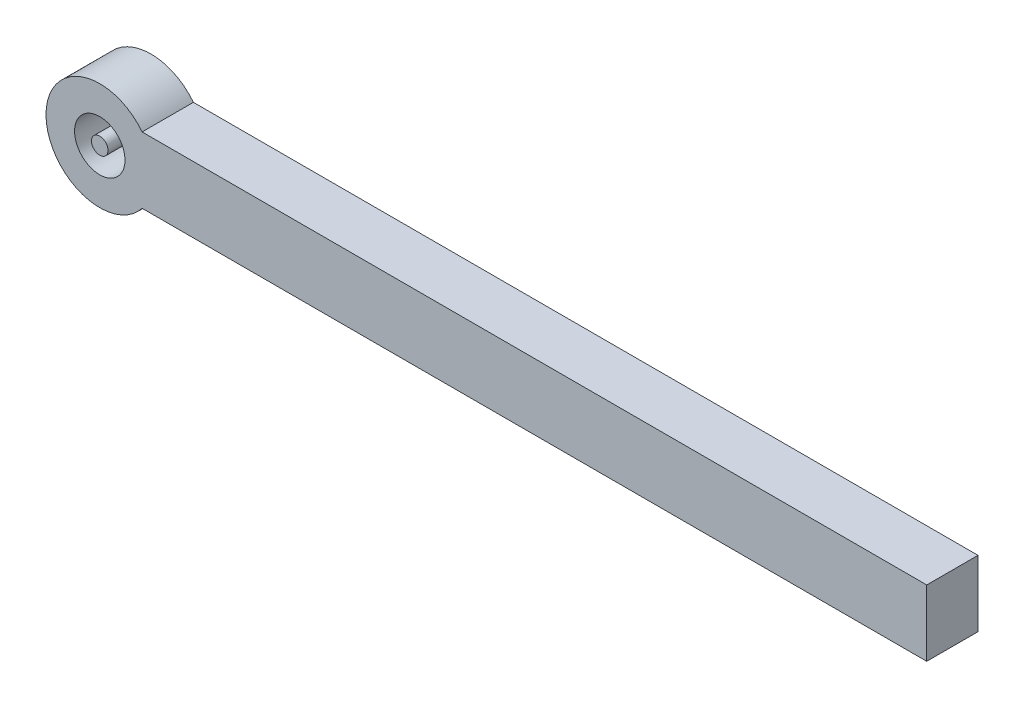
ISO-10303-21;
HEADER;
FILE_DESCRIPTION(('STEP AP214'),'2;1');
FILE_NAME('part.step','',(''),(''),'','','');
FILE_SCHEMA(('AUTOMOTIVE_DESIGN { 1 0 10303 214 1 1 1 1 }'));
ENDSEC;
DATA;
#1=APPLICATION_CONTEXT('core data for automotive mechanical design processes');
#2=APPLICATION_PROTOCOL_DEFINITION('international standard','automotive_design',2000,#1);
#3=PRODUCT_CONTEXT('',#1,'mechanical');
#4=PRODUCT('Part','Part','',(#3));
#5=PRODUCT_RELATED_PRODUCT_CATEGORY('part','',(#4));
#6=PRODUCT_DEFINITION_FORMATION('','',#4);
#7=PRODUCT_DEFINITION_CONTEXT('part definition',#1,'design');
#8=PRODUCT_DEFINITION('design','',#6,#7);
#9=PRODUCT_DEFINITION_SHAPE('','',#8);
#10=(LENGTH_UNIT() NAMED_UNIT(*) SI_UNIT(.MILLI.,.METRE.));
#11=(NAMED_UNIT(*) PLANE_ANGLE_UNIT() SI_UNIT($,.RADIAN.));
#12=(NAMED_UNIT(*) SI_UNIT($,.STERADIAN.) SOLID_ANGLE_UNIT());
#13=UNCERTAINTY_MEASURE_WITH_UNIT(LENGTH_MEASURE(1.E-05),#10,'distance_accuracy_value','');
#14=(GEOMETRIC_REPRESENTATION_CONTEXT(3) GLOBAL_UNCERTAINTY_ASSIGNED_CONTEXT((#13)) GLOBAL_UNIT_ASSIGNED_CONTEXT((#10,
#11,#12)) REPRESENTATION_CONTEXT('',''));
#15=CARTESIAN_POINT('',(0.,0.,0.));
#16=DIRECTION('',(0.,0.,1.));
#17=DIRECTION('',(1.,0.,0.));
#18=AXIS2_PLACEMENT_3D('',#15,#16,#17);
#19=CARTESIAN_POINT('',(0.,4.,4.2));
#20=DIRECTION('',(0.,1.,0.));
#21=DIRECTION('',(0.,0.,1.));
#22=AXIS2_PLACEMENT_3D('',#19,#20,#21);
#23=PLANE('',#22);
#24=DIRECTION('',(0.,0.,-1.));
#25=VECTOR('',#24,1.);
#26=CARTESIAN_POINT('',(100.,4.,4.2));
#27=LINE('',#26,#25);
#28=CARTESIAN_POINT('',(100.,4.,4.2));
#29=VERTEX_POINT('',#28);
#30=CARTESIAN_POINT('',(100.,4.,-2.));
#31=VERTEX_POINT('',#30);
#32=EDGE_CURVE('E70',#29,#31,#27,.T.);
#33=ORIENTED_EDGE('',*,*,#32,.T.);
#34=DIRECTION('',(1.,0.,0.));
#35=VECTOR('',#34,1.);
#36=CARTESIAN_POINT('',(0.,4.,-2.));
#37=LINE('',#36,#35);
#38=CARTESIAN_POINT('',(5.1234753829798,4.,-2.));
#39=VERTEX_POINT('',#38);
#40=EDGE_CURVE('E106',#39,#31,#37,.T.);
#41=ORIENTED_EDGE('',*,*,#40,.F.);
#42=DIRECTION('',(0.,0.,-1.));
#43=VECTOR('',#42,1.);
#44=CARTESIAN_POINT('',(5.1234753829798,4.,4.2));
#45=LINE('',#44,#43);
#46=CARTESIAN_POINT('',(5.1234753829798,4.,4.2));
#47=VERTEX_POINT('',#46);
#48=EDGE_CURVE('E12',#47,#39,#45,.T.);
#49=ORIENTED_EDGE('',*,*,#48,.F.);
#50=DIRECTION('',(1.,0.,0.));
#51=VECTOR('',#50,1.);
#52=CARTESIAN_POINT('',(0.,4.,4.2));
#53=LINE('',#52,#51);
#54=EDGE_CURVE('E124',#47,#29,#53,.T.);
#55=ORIENTED_EDGE('',*,*,#54,.T.);
#56=EDGE_LOOP('',(#33,#41,#49,#55));
#57=FACE_BOUND('',#56,.T.);
#58=ADVANCED_FACE('F55',(#57),#23,.T.);
#59=CARTESIAN_POINT('',(0.,0.,4.2));
#60=DIRECTION('',(0.,0.,-1.));
#61=DIRECTION('',(-1.,0.,0.));
#62=AXIS2_PLACEMENT_3D('',#59,#60,#61);
#63=CYLINDRICAL_SURFACE('',#62,6.5);
#64=ORIENTED_EDGE('',*,*,#48,.T.);
#65=CARTESIAN_POINT('',(0.,0.,-2.));
#66=DIRECTION('',(0.,0.,1.));
#67=DIRECTION('',(1.,0.,0.));
#68=AXIS2_PLACEMENT_3D('',#65,#66,#67);
#69=CIRCLE('',#68,6.5);
#70=CARTESIAN_POINT('',(5.1234753829798,-4.,-2.));
#71=VERTEX_POINT('',#70);
#72=EDGE_CURVE('E101',#39,#71,#69,.T.);
#73=ORIENTED_EDGE('',*,*,#72,.T.);
#74=DIRECTION('',(0.,0.,-1.));
#75=VECTOR('',#74,1.);
#76=CARTESIAN_POINT('',(5.1234753829798,-4.,4.2));
#77=LINE('',#76,#75);
#78=CARTESIAN_POINT('',(5.1234753829798,-4.,4.2));
#79=VERTEX_POINT('',#78);
#80=EDGE_CURVE('E63',#79,#71,#77,.T.);
#81=ORIENTED_EDGE('',*,*,#80,.F.);
#82=CARTESIAN_POINT('',(0.,0.,4.2));
#83=DIRECTION('',(0.,0.,1.));
#84=DIRECTION('',(1.,0.,0.));
#85=AXIS2_PLACEMENT_3D('',#82,#83,#84);
#86=CIRCLE('',#85,6.5);
#87=EDGE_CURVE('E102',#47,#79,#86,.T.);
#88=ORIENTED_EDGE('',*,*,#87,.F.);
#89=EDGE_LOOP('',(#64,#73,#81,#88));
#90=FACE_BOUND('',#89,.T.);
#91=ADVANCED_FACE('F98',(#90),#63,.T.);
#92=CARTESIAN_POINT('',(0.,-4.,4.2));
#93=DIRECTION('',(0.,-1.,0.));
#94=DIRECTION('',(1.,0.,0.));
#95=AXIS2_PLACEMENT_3D('',#92,#93,#94);
#96=PLANE('',#95);
#97=ORIENTED_EDGE('',*,*,#80,.T.);
#98=DIRECTION('',(-1.,0.,0.));
#99=VECTOR('',#98,1.);
#100=CARTESIAN_POINT('',(0.,-4.,-2.));
#101=LINE('',#100,#99);
#102=CARTESIAN_POINT('',(100.,-3.99999999999999,-2.));
#103=VERTEX_POINT('',#102);
#104=EDGE_CURVE('E113',#103,#71,#101,.T.);
#105=ORIENTED_EDGE('',*,*,#104,.F.);
#106=DIRECTION('',(0.,0.,-1.));
#107=VECTOR('',#106,1.);
#108=CARTESIAN_POINT('',(100.,-3.99999999999999,4.2));
#109=LINE('',#108,#107);
#110=CARTESIAN_POINT('',(100.,-3.99999999999999,4.2));
#111=VERTEX_POINT('',#110);
#112=EDGE_CURVE('E78',#111,#103,#109,.T.);
#113=ORIENTED_EDGE('',*,*,#112,.F.);
#114=DIRECTION('',(-1.,0.,0.));
#115=VECTOR('',#114,1.);
#116=CARTESIAN_POINT('',(0.,-4.,4.2));
#117=LINE('',#116,#115);
#118=EDGE_CURVE('E127',#111,#79,#117,.T.);
#119=ORIENTED_EDGE('',*,*,#118,.T.);
#120=EDGE_LOOP('',(#97,#105,#113,#119));
#121=FACE_BOUND('',#120,.T.);
#122=ADVANCED_FACE('F134',(#121),#96,.T.);
#123=CARTESIAN_POINT('',(0.,0.,4.2));
#124=DIRECTION('',(0.,0.,-1.));
#125=DIRECTION('',(-1.,0.,0.));
#126=AXIS2_PLACEMENT_3D('',#123,#124,#125);
#127=CYLINDRICAL_SURFACE('',#126,3.05);
#128=CARTESIAN_POINT('',(0.,0.,4.2));
#129=DIRECTION('',(0.,0.,1.));
#130=DIRECTION('',(1.,0.,0.));
#131=AXIS2_PLACEMENT_3D('',#128,#129,#130);
#132=CIRCLE('',#131,3.05);
#133=CARTESIAN_POINT('',(3.05,0.,4.2));
#134=VERTEX_POINT('',#133);
#135=EDGE_CURVE('E121',#134,#134,#132,.T.);
#136=ORIENTED_EDGE('',*,*,#135,.T.);
#137=EDGE_LOOP('',(#136));
#138=FACE_BOUND('',#137,.T.);
#139=CARTESIAN_POINT('',(0.,0.,0.));
#140=DIRECTION('',(0.,0.,1.));
#141=DIRECTION('',(1.,0.,0.));
#142=AXIS2_PLACEMENT_3D('',#139,#140,#141);
#143=CIRCLE('',#142,3.05);
#144=CARTESIAN_POINT('',(3.05,0.,0.));
#145=VERTEX_POINT('',#144);
#146=EDGE_CURVE('E120',#145,#145,#143,.T.);
#147=ORIENTED_EDGE('',*,*,#146,.F.);
#148=EDGE_LOOP('',(#147));
#149=FACE_BOUND('',#148,.T.);
#150=ADVANCED_FACE('F57',(#138,#149),#127,.F.);
#151=CARTESIAN_POINT('',(100.,0.,4.2));
#152=DIRECTION('',(1.,0.,0.));
#153=DIRECTION('',(0.,0.,-1.));
#154=AXIS2_PLACEMENT_3D('',#151,#152,#153);
#155=PLANE('',#154);
#156=ORIENTED_EDGE('',*,*,#112,.T.);
#157=DIRECTION('',(0.,-1.,0.));
#158=VECTOR('',#157,1.);
#159=CARTESIAN_POINT('',(100.,0.,-2.));
#160=LINE('',#159,#158);
#161=EDGE_CURVE('E115',#31,#103,#160,.T.);
#162=ORIENTED_EDGE('',*,*,#161,.F.);
#163=ORIENTED_EDGE('',*,*,#32,.F.);
#164=DIRECTION('',(0.,-1.,0.));
#165=VECTOR('',#164,1.);
#166=CARTESIAN_POINT('',(100.,0.,4.2));
#167=LINE('',#166,#165);
#168=EDGE_CURVE('E129',#29,#111,#167,.T.);
#169=ORIENTED_EDGE('',*,*,#168,.T.);
#170=EDGE_LOOP('',(#156,#162,#163,#169));
#171=FACE_BOUND('',#170,.T.);
#172=ADVANCED_FACE('F138',(#171),#155,.T.);
#173=CARTESIAN_POINT('',(0.,0.,4.2));
#174=DIRECTION('',(0.,0.,1.));
#175=DIRECTION('',(1.,0.,0.));
#176=AXIS2_PLACEMENT_3D('',#173,#174,#175);
#177=PLANE('',#176);
#178=ORIENTED_EDGE('',*,*,#135,.F.);
#179=EDGE_LOOP('',(#178));
#180=FACE_BOUND('',#179,.T.);
#181=ORIENTED_EDGE('',*,*,#54,.F.);
#182=ORIENTED_EDGE('',*,*,#87,.T.);
#183=ORIENTED_EDGE('',*,*,#118,.F.);
#184=ORIENTED_EDGE('',*,*,#168,.F.);
#185=EDGE_LOOP('',(#181,#182,#183,#184));
#186=FACE_BOUND('',#185,.T.);
#187=ADVANCED_FACE('F137',(#180,#186),#177,.T.);
#188=CARTESIAN_POINT('',(0.,0.,0.));
#189=DIRECTION('',(0.,0.,1.));
#190=DIRECTION('',(1.,0.,0.));
#191=AXIS2_PLACEMENT_3D('',#188,#189,#190);
#192=PLANE('',#191);
#193=CARTESIAN_POINT('',(0.,0.,0.));
#194=DIRECTION('',(0.,0.,1.));
#195=DIRECTION('',(1.,0.,0.));
#196=AXIS2_PLACEMENT_3D('',#193,#194,#195);
#197=CIRCLE('',#196,1.);
#198=CARTESIAN_POINT('',(1.,0.,0.));
#199=VERTEX_POINT('',#198);
#200=EDGE_CURVE('E109',#199,#199,#197,.T.);
#201=ORIENTED_EDGE('',*,*,#200,.F.);
#202=EDGE_LOOP('',(#201));
#203=FACE_BOUND('',#202,.T.);
#204=ORIENTED_EDGE('',*,*,#146,.T.);
#205=EDGE_LOOP('',(#204));
#206=FACE_BOUND('',#205,.T.);
#207=ADVANCED_FACE('F145',(#203,#206),#192,.T.);
#208=CARTESIAN_POINT('',(0.,0.,-2.));
#209=DIRECTION('',(0.,0.,1.));
#210=DIRECTION('',(1.,0.,0.));
#211=AXIS2_PLACEMENT_3D('',#208,#209,#210);
#212=PLANE('',#211);
#213=ORIENTED_EDGE('',*,*,#40,.T.);
#214=ORIENTED_EDGE('',*,*,#161,.T.);
#215=ORIENTED_EDGE('',*,*,#104,.T.);
#216=ORIENTED_EDGE('',*,*,#72,.F.);
#217=EDGE_LOOP('',(#213,#214,#215,#216));
#218=FACE_BOUND('',#217,.T.);
#219=ADVANCED_FACE('F112',(#218),#212,.F.);
#220=CARTESIAN_POINT('',(0.,0.,4.2));
#221=DIRECTION('',(0.,0.,-1.));
#222=DIRECTION('',(-1.,0.,0.));
#223=AXIS2_PLACEMENT_3D('',#220,#221,#222);
#224=CYLINDRICAL_SURFACE('',#223,1.);
#225=CARTESIAN_POINT('',(0.,0.,4.2));
#226=DIRECTION('',(0.,0.,1.));
#227=DIRECTION('',(1.,0.,0.));
#228=AXIS2_PLACEMENT_3D('',#225,#226,#227);
#229=CIRCLE('',#228,1.);
#230=CARTESIAN_POINT('',(1.,0.,4.2));
#231=VERTEX_POINT('',#230);
#232=EDGE_CURVE('E249',#231,#231,#229,.T.);
#233=ORIENTED_EDGE('',*,*,#232,.F.);
#234=EDGE_LOOP('',(#233));
#235=FACE_BOUND('',#234,.T.);
#236=ORIENTED_EDGE('',*,*,#200,.T.);
#237=EDGE_LOOP('',(#236));
#238=FACE_BOUND('',#237,.T.);
#239=ADVANCED_FACE('F222',(#235,#238),#224,.T.);
#240=CARTESIAN_POINT('',(0.,0.,4.2));
#241=DIRECTION('',(0.,0.,1.));
#242=DIRECTION('',(1.,0.,0.));
#243=AXIS2_PLACEMENT_3D('',#240,#241,#242);
#244=PLANE('',#243);
#245=ORIENTED_EDGE('',*,*,#232,.T.);
#246=EDGE_LOOP('',(#245));
#247=FACE_BOUND('',#246,.T.);
#248=ADVANCED_FACE('F232',(#247),#244,.T.);
#249=CLOSED_SHELL('',(#58,#91,#122,#150,#172,#187,#207,#219,#239,#248));
#250=MANIFOLD_SOLID_BREP('B2',#249);
#251=ADVANCED_BREP_SHAPE_REPRESENTATION('',(#18,#250),#14);
#252=SHAPE_DEFINITION_REPRESENTATION(#9,#251);
ENDSEC;
END-ISO-10303-21;
